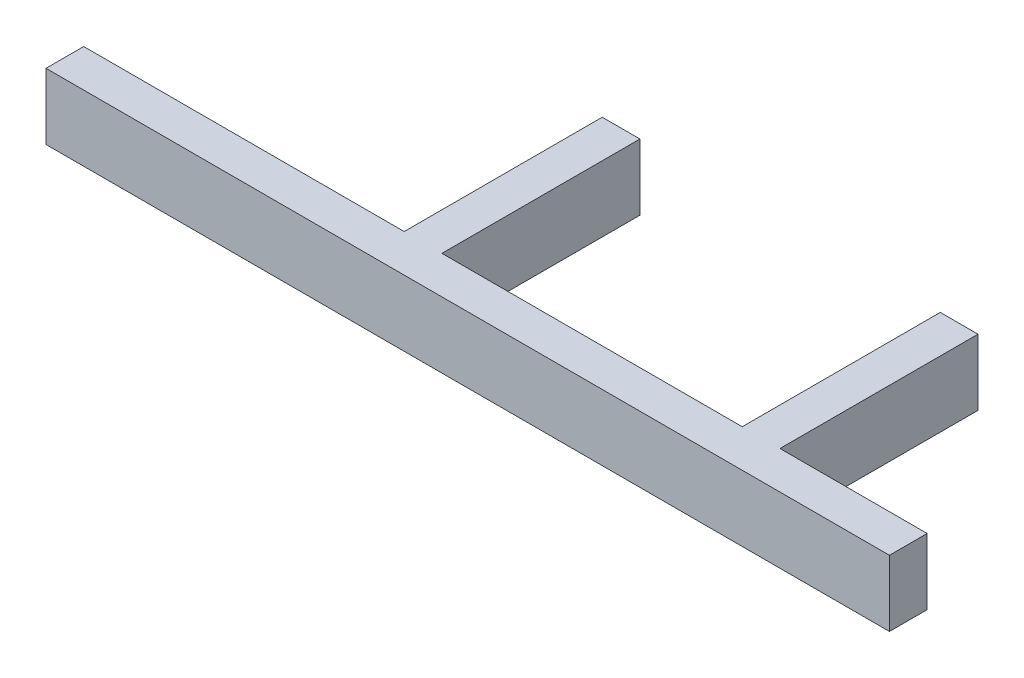
ISO-10303-21;
HEADER;
FILE_DESCRIPTION(('STEP AP214'),'2;1');
FILE_NAME('part.step','',(''),(''),'','','');
FILE_SCHEMA(('AUTOMOTIVE_DESIGN { 1 0 10303 214 1 1 1 1 }'));
ENDSEC;
DATA;
#1=APPLICATION_CONTEXT('core data for automotive mechanical design processes');
#2=APPLICATION_PROTOCOL_DEFINITION('international standard','automotive_design',2000,#1);
#3=PRODUCT_CONTEXT('',#1,'mechanical');
#4=PRODUCT('Part','Part','',(#3));
#5=PRODUCT_RELATED_PRODUCT_CATEGORY('part','',(#4));
#6=PRODUCT_DEFINITION_FORMATION('','',#4);
#7=PRODUCT_DEFINITION_CONTEXT('part definition',#1,'design');
#8=PRODUCT_DEFINITION('design','',#6,#7);
#9=PRODUCT_DEFINITION_SHAPE('','',#8);
#10=(LENGTH_UNIT() NAMED_UNIT(*) SI_UNIT(.MILLI.,.METRE.));
#11=(NAMED_UNIT(*) PLANE_ANGLE_UNIT() SI_UNIT($,.RADIAN.));
#12=(NAMED_UNIT(*) SI_UNIT($,.STERADIAN.) SOLID_ANGLE_UNIT());
#13=UNCERTAINTY_MEASURE_WITH_UNIT(LENGTH_MEASURE(1.E-05),#10,'distance_accuracy_value','');
#14=(GEOMETRIC_REPRESENTATION_CONTEXT(3) GLOBAL_UNCERTAINTY_ASSIGNED_CONTEXT((#13)) GLOBAL_UNIT_ASSIGNED_CONTEXT((#10,
#11,#12)) REPRESENTATION_CONTEXT('',''));
#15=CARTESIAN_POINT('',(0.,0.,0.));
#16=DIRECTION('',(0.,0.,1.));
#17=DIRECTION('',(1.,0.,0.));
#18=AXIS2_PLACEMENT_3D('',#15,#16,#17);
#19=CARTESIAN_POINT('',(0.,7.,1.66692066897035));
#20=DIRECTION('',(0.,0.,1.));
#21=DIRECTION('',(1.,0.,0.));
#22=AXIS2_PLACEMENT_3D('',#19,#20,#21);
#23=PLANE('',#22);
#24=DIRECTION('',(-1.,0.,0.));
#25=VECTOR('',#24,1.);
#26=CARTESIAN_POINT('',(0.,0.,1.66692066897035));
#27=LINE('',#26,#25);
#28=CARTESIAN_POINT('',(-106.016800792953,0.,1.66692066897037));
#29=VERTEX_POINT('',#28);
#30=CARTESIAN_POINT('',(-140.,0.,1.66692066897037));
#31=VERTEX_POINT('',#30);
#32=EDGE_CURVE('E11',#29,#31,#27,.T.);
#33=ORIENTED_EDGE('',*,*,#32,.T.);
#34=DIRECTION('',(0.,-1.,0.));
#35=VECTOR('',#34,1.);
#36=CARTESIAN_POINT('',(-140.,7.,1.66692066897037));
#37=LINE('',#36,#35);
#38=CARTESIAN_POINT('',(-140.,7.,1.66692066897037));
#39=VERTEX_POINT('',#38);
#40=EDGE_CURVE('E258',#39,#31,#37,.T.);
#41=ORIENTED_EDGE('',*,*,#40,.F.);
#42=DIRECTION('',(-1.,0.,0.));
#43=VECTOR('',#42,1.);
#44=CARTESIAN_POINT('',(0.,7.,1.66692066897035));
#45=LINE('',#44,#43);
#46=CARTESIAN_POINT('',(-106.016800792953,7.,1.66692066897037));
#47=VERTEX_POINT('',#46);
#48=EDGE_CURVE('E46',#47,#39,#45,.T.);
#49=ORIENTED_EDGE('',*,*,#48,.F.);
#50=DIRECTION('',(0.,-1.,0.));
#51=VECTOR('',#50,1.);
#52=CARTESIAN_POINT('',(-106.016800792953,7.,1.66692066897037));
#53=LINE('',#52,#51);
#54=EDGE_CURVE('E170',#47,#29,#53,.T.);
#55=ORIENTED_EDGE('',*,*,#54,.T.);
#56=EDGE_LOOP('',(#33,#41,#49,#55));
#57=FACE_BOUND('',#56,.T.);
#58=ADVANCED_FACE('F42',(#57),#23,.F.);
#59=CARTESIAN_POINT('',(-140.,7.,0.));
#60=DIRECTION('',(1.,0.,0.));
#61=DIRECTION('',(0.,0.,-1.));
#62=AXIS2_PLACEMENT_3D('',#59,#60,#61);
#63=PLANE('',#62);
#64=DIRECTION('',(0.,0.,1.));
#65=VECTOR('',#64,1.);
#66=CARTESIAN_POINT('',(-140.,0.,0.));
#67=LINE('',#66,#65);
#68=CARTESIAN_POINT('',(-140.,0.,5.66692066897037));
#69=VERTEX_POINT('',#68);
#70=EDGE_CURVE('E52',#31,#69,#67,.T.);
#71=ORIENTED_EDGE('',*,*,#70,.T.);
#72=DIRECTION('',(0.,-1.,0.));
#73=VECTOR('',#72,1.);
#74=CARTESIAN_POINT('',(-140.,7.,5.66692066897037));
#75=LINE('',#74,#73);
#76=CARTESIAN_POINT('',(-140.,7.,5.66692066897037));
#77=VERTEX_POINT('',#76);
#78=EDGE_CURVE('E146',#77,#69,#75,.T.);
#79=ORIENTED_EDGE('',*,*,#78,.F.);
#80=DIRECTION('',(0.,0.,1.));
#81=VECTOR('',#80,1.);
#82=CARTESIAN_POINT('',(-140.,7.,0.));
#83=LINE('',#82,#81);
#84=EDGE_CURVE('E100',#39,#77,#83,.T.);
#85=ORIENTED_EDGE('',*,*,#84,.F.);
#86=ORIENTED_EDGE('',*,*,#40,.T.);
#87=EDGE_LOOP('',(#71,#79,#85,#86));
#88=FACE_BOUND('',#87,.T.);
#89=ADVANCED_FACE('F259',(#88),#63,.F.);
#90=CARTESIAN_POINT('',(0.,7.,5.66692066897037));
#91=DIRECTION('',(0.,0.,-1.));
#92=DIRECTION('',(-1.,0.,0.));
#93=AXIS2_PLACEMENT_3D('',#90,#91,#92);
#94=PLANE('',#93);
#95=DIRECTION('',(1.,0.,0.));
#96=VECTOR('',#95,1.);
#97=CARTESIAN_POINT('',(0.,0.,5.66692066897037));
#98=LINE('',#97,#96);
#99=CARTESIAN_POINT('',(-50.5611979215626,0.,5.66692066897037));
#100=VERTEX_POINT('',#99);
#101=EDGE_CURVE('E140',#69,#100,#98,.T.);
#102=ORIENTED_EDGE('',*,*,#101,.T.);
#103=DIRECTION('',(0.,-1.,0.));
#104=VECTOR('',#103,1.);
#105=CARTESIAN_POINT('',(-50.5611979215626,7.,5.66692066897037));
#106=LINE('',#105,#104);
#107=CARTESIAN_POINT('',(-50.5611979215626,7.,5.66692066897037));
#108=VERTEX_POINT('',#107);
#109=EDGE_CURVE('E144',#108,#100,#106,.T.);
#110=ORIENTED_EDGE('',*,*,#109,.F.);
#111=DIRECTION('',(1.,0.,0.));
#112=VECTOR('',#111,1.);
#113=CARTESIAN_POINT('',(0.,7.,5.66692066897037));
#114=LINE('',#113,#112);
#115=EDGE_CURVE('E185',#77,#108,#114,.T.);
#116=ORIENTED_EDGE('',*,*,#115,.F.);
#117=ORIENTED_EDGE('',*,*,#78,.T.);
#118=EDGE_LOOP('',(#102,#110,#116,#117));
#119=FACE_BOUND('',#118,.T.);
#120=ADVANCED_FACE('F142',(#119),#94,.F.);
#121=CARTESIAN_POINT('',(-50.5611979215626,7.,0.));
#122=DIRECTION('',(-1.,0.,0.));
#123=DIRECTION('',(0.,0.,1.));
#124=AXIS2_PLACEMENT_3D('',#121,#122,#123);
#125=PLANE('',#124);
#126=DIRECTION('',(0.,0.,-1.));
#127=VECTOR('',#126,1.);
#128=CARTESIAN_POINT('',(-50.5611979215626,0.,0.));
#129=LINE('',#128,#127);
#130=CARTESIAN_POINT('',(-50.5611979215626,0.,1.66692066897037));
#131=VERTEX_POINT('',#130);
#132=EDGE_CURVE('E148',#100,#131,#129,.T.);
#133=ORIENTED_EDGE('',*,*,#132,.T.);
#134=DIRECTION('',(0.,-1.,0.));
#135=VECTOR('',#134,1.);
#136=CARTESIAN_POINT('',(-50.5611979215626,7.,1.66692066897037));
#137=LINE('',#136,#135);
#138=CARTESIAN_POINT('',(-50.5611979215626,7.,1.66692066897037));
#139=VERTEX_POINT('',#138);
#140=EDGE_CURVE('E155',#139,#131,#137,.T.);
#141=ORIENTED_EDGE('',*,*,#140,.F.);
#142=DIRECTION('',(0.,0.,-1.));
#143=VECTOR('',#142,1.);
#144=CARTESIAN_POINT('',(-50.5611979215626,7.,0.));
#145=LINE('',#144,#143);
#146=EDGE_CURVE('E154',#108,#139,#145,.T.);
#147=ORIENTED_EDGE('',*,*,#146,.F.);
#148=ORIENTED_EDGE('',*,*,#109,.T.);
#149=EDGE_LOOP('',(#133,#141,#147,#148));
#150=FACE_BOUND('',#149,.T.);
#151=ADVANCED_FACE('F151',(#150),#125,.F.);
#152=CARTESIAN_POINT('',(0.,7.,1.66692066897037));
#153=DIRECTION('',(0.,0.,1.));
#154=DIRECTION('',(1.,0.,0.));
#155=AXIS2_PLACEMENT_3D('',#152,#153,#154);
#156=PLANE('',#155);
#157=DIRECTION('',(-1.,0.,0.));
#158=VECTOR('',#157,1.);
#159=CARTESIAN_POINT('',(0.,0.,1.66692066897037));
#160=LINE('',#159,#158);
#161=CARTESIAN_POINT('',(-66.16788596605,0.,1.66692066897037));
#162=VERTEX_POINT('',#161);
#163=EDGE_CURVE('E160',#131,#162,#160,.T.);
#164=ORIENTED_EDGE('',*,*,#163,.T.);
#165=DIRECTION('',(0.,-1.,0.));
#166=VECTOR('',#165,1.);
#167=CARTESIAN_POINT('',(-66.16788596605,7.,1.66692066897037));
#168=LINE('',#167,#166);
#169=CARTESIAN_POINT('',(-66.16788596605,7.,1.66692066897037));
#170=VERTEX_POINT('',#169);
#171=EDGE_CURVE('E210',#170,#162,#168,.T.);
#172=ORIENTED_EDGE('',*,*,#171,.F.);
#173=DIRECTION('',(-1.,0.,0.));
#174=VECTOR('',#173,1.);
#175=CARTESIAN_POINT('',(0.,7.,1.66692066897037));
#176=LINE('',#175,#174);
#177=EDGE_CURVE('E182',#139,#170,#176,.T.);
#178=ORIENTED_EDGE('',*,*,#177,.F.);
#179=ORIENTED_EDGE('',*,*,#140,.T.);
#180=EDGE_LOOP('',(#164,#172,#178,#179));
#181=FACE_BOUND('',#180,.T.);
#182=ADVANCED_FACE('F253',(#181),#156,.F.);
#183=CARTESIAN_POINT('',(-66.16788596605,7.,0.));
#184=DIRECTION('',(-1.,0.,0.));
#185=DIRECTION('',(0.,0.,1.));
#186=AXIS2_PLACEMENT_3D('',#183,#184,#185);
#187=PLANE('',#186);
#188=DIRECTION('',(0.,0.,-1.));
#189=VECTOR('',#188,1.);
#190=CARTESIAN_POINT('',(-66.16788596605,0.,0.));
#191=LINE('',#190,#189);
#192=CARTESIAN_POINT('',(-66.16788596605,0.,-19.3319582425811));
#193=VERTEX_POINT('',#192);
#194=EDGE_CURVE('E162',#162,#193,#191,.T.);
#195=ORIENTED_EDGE('',*,*,#194,.T.);
#196=DIRECTION('',(0.,-1.,0.));
#197=VECTOR('',#196,1.);
#198=CARTESIAN_POINT('',(-66.16788596605,7.,-19.3319582425811));
#199=LINE('',#198,#197);
#200=CARTESIAN_POINT('',(-66.16788596605,7.,-19.3319582425811));
#201=VERTEX_POINT('',#200);
#202=EDGE_CURVE('E207',#201,#193,#199,.T.);
#203=ORIENTED_EDGE('',*,*,#202,.F.);
#204=DIRECTION('',(0.,0.,-1.));
#205=VECTOR('',#204,1.);
#206=CARTESIAN_POINT('',(-66.16788596605,7.,0.));
#207=LINE('',#206,#205);
#208=EDGE_CURVE('E180',#170,#201,#207,.T.);
#209=ORIENTED_EDGE('',*,*,#208,.F.);
#210=ORIENTED_EDGE('',*,*,#171,.T.);
#211=EDGE_LOOP('',(#195,#203,#209,#210));
#212=FACE_BOUND('',#211,.T.);
#213=ADVANCED_FACE('F205',(#212),#187,.F.);
#214=CARTESIAN_POINT('',(0.,7.,-19.3319582425811));
#215=DIRECTION('',(0.,0.,1.));
#216=DIRECTION('',(1.,0.,0.));
#217=AXIS2_PLACEMENT_3D('',#214,#215,#216);
#218=PLANE('',#217);
#219=DIRECTION('',(-1.,0.,0.));
#220=VECTOR('',#219,1.);
#221=CARTESIAN_POINT('',(0.,0.,-19.3319582425811));
#222=LINE('',#221,#220);
#223=CARTESIAN_POINT('',(-70.1678859660501,0.,-19.3319582425811));
#224=VERTEX_POINT('',#223);
#225=EDGE_CURVE('E200',#193,#224,#222,.T.);
#226=ORIENTED_EDGE('',*,*,#225,.T.);
#227=DIRECTION('',(0.,-1.,0.));
#228=VECTOR('',#227,1.);
#229=CARTESIAN_POINT('',(-70.1678859660501,7.,-19.3319582425811));
#230=LINE('',#229,#228);
#231=CARTESIAN_POINT('',(-70.1678859660501,7.,-19.3319582425811));
#232=VERTEX_POINT('',#231);
#233=EDGE_CURVE('E216',#232,#224,#230,.T.);
#234=ORIENTED_EDGE('',*,*,#233,.F.);
#235=DIRECTION('',(-1.,0.,0.));
#236=VECTOR('',#235,1.);
#237=CARTESIAN_POINT('',(0.,7.,-19.3319582425811));
#238=LINE('',#237,#236);
#239=EDGE_CURVE('E178',#201,#232,#238,.T.);
#240=ORIENTED_EDGE('',*,*,#239,.F.);
#241=ORIENTED_EDGE('',*,*,#202,.T.);
#242=EDGE_LOOP('',(#226,#234,#240,#241));
#243=FACE_BOUND('',#242,.T.);
#244=ADVANCED_FACE('F213',(#243),#218,.F.);
#245=CARTESIAN_POINT('',(-70.1678859660501,7.,0.));
#246=DIRECTION('',(1.,0.,0.));
#247=DIRECTION('',(0.,0.,-1.));
#248=AXIS2_PLACEMENT_3D('',#245,#246,#247);
#249=PLANE('',#248);
#250=DIRECTION('',(0.,0.,1.));
#251=VECTOR('',#250,1.);
#252=CARTESIAN_POINT('',(-70.1678859660501,0.,0.));
#253=LINE('',#252,#251);
#254=CARTESIAN_POINT('',(-70.1678859660501,0.,1.66692066897037));
#255=VERTEX_POINT('',#254);
#256=EDGE_CURVE('E198',#224,#255,#253,.T.);
#257=ORIENTED_EDGE('',*,*,#256,.T.);
#258=DIRECTION('',(0.,-1.,0.));
#259=VECTOR('',#258,1.);
#260=CARTESIAN_POINT('',(-70.1678859660501,7.,1.66692066897037));
#261=LINE('',#260,#259);
#262=CARTESIAN_POINT('',(-70.1678859660501,7.,1.66692066897037));
#263=VERTEX_POINT('',#262);
#264=EDGE_CURVE('E226',#263,#255,#261,.T.);
#265=ORIENTED_EDGE('',*,*,#264,.F.);
#266=DIRECTION('',(0.,0.,1.));
#267=VECTOR('',#266,1.);
#268=CARTESIAN_POINT('',(-70.1678859660501,7.,0.));
#269=LINE('',#268,#267);
#270=EDGE_CURVE('E176',#232,#263,#269,.T.);
#271=ORIENTED_EDGE('',*,*,#270,.F.);
#272=ORIENTED_EDGE('',*,*,#233,.T.);
#273=EDGE_LOOP('',(#257,#265,#271,#272));
#274=FACE_BOUND('',#273,.T.);
#275=ADVANCED_FACE('F224',(#274),#249,.F.);
#276=CARTESIAN_POINT('',(0.,7.,1.66692066897039));
#277=DIRECTION('',(0.,0.,1.));
#278=DIRECTION('',(1.,0.,0.));
#279=AXIS2_PLACEMENT_3D('',#276,#277,#278);
#280=PLANE('',#279);
#281=DIRECTION('',(-1.,0.,0.));
#282=VECTOR('',#281,1.);
#283=CARTESIAN_POINT('',(0.,0.,1.66692066897039));
#284=LINE('',#283,#282);
#285=CARTESIAN_POINT('',(-102.016800792953,0.,1.66692066897037));
#286=VERTEX_POINT('',#285);
#287=EDGE_CURVE('E196',#255,#286,#284,.T.);
#288=ORIENTED_EDGE('',*,*,#287,.T.);
#289=DIRECTION('',(0.,-1.,0.));
#290=VECTOR('',#289,1.);
#291=CARTESIAN_POINT('',(-102.016800792953,7.,1.66692066897037));
#292=LINE('',#291,#290);
#293=CARTESIAN_POINT('',(-102.016800792953,7.,1.66692066897037));
#294=VERTEX_POINT('',#293);
#295=EDGE_CURVE('E232',#294,#286,#292,.T.);
#296=ORIENTED_EDGE('',*,*,#295,.F.);
#297=DIRECTION('',(-1.,0.,0.));
#298=VECTOR('',#297,1.);
#299=CARTESIAN_POINT('',(0.,7.,1.66692066897039));
#300=LINE('',#299,#298);
#301=EDGE_CURVE('E174',#263,#294,#300,.T.);
#302=ORIENTED_EDGE('',*,*,#301,.F.);
#303=ORIENTED_EDGE('',*,*,#264,.T.);
#304=EDGE_LOOP('',(#288,#296,#302,#303));
#305=FACE_BOUND('',#304,.T.);
#306=ADVANCED_FACE('F229',(#305),#280,.F.);
#307=CARTESIAN_POINT('',(-102.016800792953,7.,0.));
#308=DIRECTION('',(-1.,0.,0.));
#309=DIRECTION('',(0.,0.,1.));
#310=AXIS2_PLACEMENT_3D('',#307,#308,#309);
#311=PLANE('',#310);
#312=DIRECTION('',(0.,0.,-1.));
#313=VECTOR('',#312,1.);
#314=CARTESIAN_POINT('',(-102.016800792953,0.,0.));
#315=LINE('',#314,#313);
#316=CARTESIAN_POINT('',(-102.016800792953,0.,-19.3319582425811));
#317=VERTEX_POINT('',#316);
#318=EDGE_CURVE('E190',#286,#317,#315,.T.);
#319=ORIENTED_EDGE('',*,*,#318,.T.);
#320=DIRECTION('',(0.,-1.,0.));
#321=VECTOR('',#320,1.);
#322=CARTESIAN_POINT('',(-102.016800792953,7.,-19.3319582425811));
#323=LINE('',#322,#321);
#324=CARTESIAN_POINT('',(-102.016800792953,7.,-19.3319582425811));
#325=VERTEX_POINT('',#324);
#326=EDGE_CURVE('E234',#325,#317,#323,.T.);
#327=ORIENTED_EDGE('',*,*,#326,.F.);
#328=DIRECTION('',(0.,0.,-1.));
#329=VECTOR('',#328,1.);
#330=CARTESIAN_POINT('',(-102.016800792953,7.,0.));
#331=LINE('',#330,#329);
#332=EDGE_CURVE('E172',#294,#325,#331,.T.);
#333=ORIENTED_EDGE('',*,*,#332,.F.);
#334=ORIENTED_EDGE('',*,*,#295,.T.);
#335=EDGE_LOOP('',(#319,#327,#333,#334));
#336=FACE_BOUND('',#335,.T.);
#337=ADVANCED_FACE('F250',(#336),#311,.F.);
#338=CARTESIAN_POINT('',(0.,7.,-19.3319582425811));
#339=DIRECTION('',(0.,0.,1.));
#340=DIRECTION('',(1.,0.,0.));
#341=AXIS2_PLACEMENT_3D('',#338,#339,#340);
#342=PLANE('',#341);
#343=DIRECTION('',(-1.,0.,0.));
#344=VECTOR('',#343,1.);
#345=CARTESIAN_POINT('',(0.,0.,-19.3319582425811));
#346=LINE('',#345,#344);
#347=CARTESIAN_POINT('',(-106.016800792953,0.,-19.3319582425811));
#348=VERTEX_POINT('',#347);
#349=EDGE_CURVE('E188',#317,#348,#346,.T.);
#350=ORIENTED_EDGE('',*,*,#349,.T.);
#351=DIRECTION('',(0.,-1.,0.));
#352=VECTOR('',#351,1.);
#353=CARTESIAN_POINT('',(-106.016800792953,7.,-19.3319582425811));
#354=LINE('',#353,#352);
#355=CARTESIAN_POINT('',(-106.016800792953,7.,-19.3319582425811));
#356=VERTEX_POINT('',#355);
#357=EDGE_CURVE('E239',#356,#348,#354,.T.);
#358=ORIENTED_EDGE('',*,*,#357,.F.);
#359=DIRECTION('',(-1.,0.,0.));
#360=VECTOR('',#359,1.);
#361=CARTESIAN_POINT('',(0.,7.,-19.3319582425811));
#362=LINE('',#361,#360);
#363=EDGE_CURVE('E169',#325,#356,#362,.T.);
#364=ORIENTED_EDGE('',*,*,#363,.F.);
#365=ORIENTED_EDGE('',*,*,#326,.T.);
#366=EDGE_LOOP('',(#350,#358,#364,#365));
#367=FACE_BOUND('',#366,.T.);
#368=ADVANCED_FACE('F245',(#367),#342,.F.);
#369=CARTESIAN_POINT('',(-106.016800792953,7.,0.));
#370=DIRECTION('',(1.,0.,0.));
#371=DIRECTION('',(0.,0.,-1.));
#372=AXIS2_PLACEMENT_3D('',#369,#370,#371);
#373=PLANE('',#372);
#374=DIRECTION('',(0.,0.,1.));
#375=VECTOR('',#374,1.);
#376=CARTESIAN_POINT('',(-106.016800792953,0.,0.));
#377=LINE('',#376,#375);
#378=EDGE_CURVE('E111',#348,#29,#377,.T.);
#379=ORIENTED_EDGE('',*,*,#378,.T.);
#380=ORIENTED_EDGE('',*,*,#54,.F.);
#381=DIRECTION('',(0.,0.,1.));
#382=VECTOR('',#381,1.);
#383=CARTESIAN_POINT('',(-106.016800792953,7.,0.));
#384=LINE('',#383,#382);
#385=EDGE_CURVE('E167',#356,#47,#384,.T.);
#386=ORIENTED_EDGE('',*,*,#385,.F.);
#387=ORIENTED_EDGE('',*,*,#357,.T.);
#388=EDGE_LOOP('',(#379,#380,#386,#387));
#389=FACE_BOUND('',#388,.T.);
#390=ADVANCED_FACE('F286',(#389),#373,.F.);
#391=CARTESIAN_POINT('',(0.,7.,0.));
#392=DIRECTION('',(0.,1.,0.));
#393=DIRECTION('',(0.,0.,1.));
#394=AXIS2_PLACEMENT_3D('',#391,#392,#393);
#395=PLANE('',#394);
#396=ORIENTED_EDGE('',*,*,#48,.T.);
#397=ORIENTED_EDGE('',*,*,#84,.T.);
#398=ORIENTED_EDGE('',*,*,#115,.T.);
#399=ORIENTED_EDGE('',*,*,#146,.T.);
#400=ORIENTED_EDGE('',*,*,#177,.T.);
#401=ORIENTED_EDGE('',*,*,#208,.T.);
#402=ORIENTED_EDGE('',*,*,#239,.T.);
#403=ORIENTED_EDGE('',*,*,#270,.T.);
#404=ORIENTED_EDGE('',*,*,#301,.T.);
#405=ORIENTED_EDGE('',*,*,#332,.T.);
#406=ORIENTED_EDGE('',*,*,#363,.T.);
#407=ORIENTED_EDGE('',*,*,#385,.T.);
#408=EDGE_LOOP('',(#396,#397,#398,#399,#400,#401,#402,#403,#404,#405,#406,#407));
#409=FACE_BOUND('',#408,.T.);
#410=ADVANCED_FACE('F44',(#409),#395,.T.);
#411=CARTESIAN_POINT('',(0.,0.,0.));
#412=DIRECTION('',(0.,1.,0.));
#413=DIRECTION('',(0.,0.,1.));
#414=AXIS2_PLACEMENT_3D('',#411,#412,#413);
#415=PLANE('',#414);
#416=ORIENTED_EDGE('',*,*,#32,.F.);
#417=ORIENTED_EDGE('',*,*,#378,.F.);
#418=ORIENTED_EDGE('',*,*,#349,.F.);
#419=ORIENTED_EDGE('',*,*,#318,.F.);
#420=ORIENTED_EDGE('',*,*,#287,.F.);
#421=ORIENTED_EDGE('',*,*,#256,.F.);
#422=ORIENTED_EDGE('',*,*,#225,.F.);
#423=ORIENTED_EDGE('',*,*,#194,.F.);
#424=ORIENTED_EDGE('',*,*,#163,.F.);
#425=ORIENTED_EDGE('',*,*,#132,.F.);
#426=ORIENTED_EDGE('',*,*,#101,.F.);
#427=ORIENTED_EDGE('',*,*,#70,.F.);
#428=EDGE_LOOP('',(#416,#417,#418,#419,#420,#421,#422,#423,#424,#425,#426,#427));
#429=FACE_BOUND('',#428,.T.);
#430=ADVANCED_FACE('F158',(#429),#415,.F.);
#431=CLOSED_SHELL('',(#58,#89,#120,#151,#182,#213,#244,#275,#306,#337,#368,#390,#410,#430));
#432=MANIFOLD_SOLID_BREP('B2',#431);
#433=ADVANCED_BREP_SHAPE_REPRESENTATION('',(#18,#432),#14);
#434=SHAPE_DEFINITION_REPRESENTATION(#9,#433);
ENDSEC;
END-ISO-10303-21;
